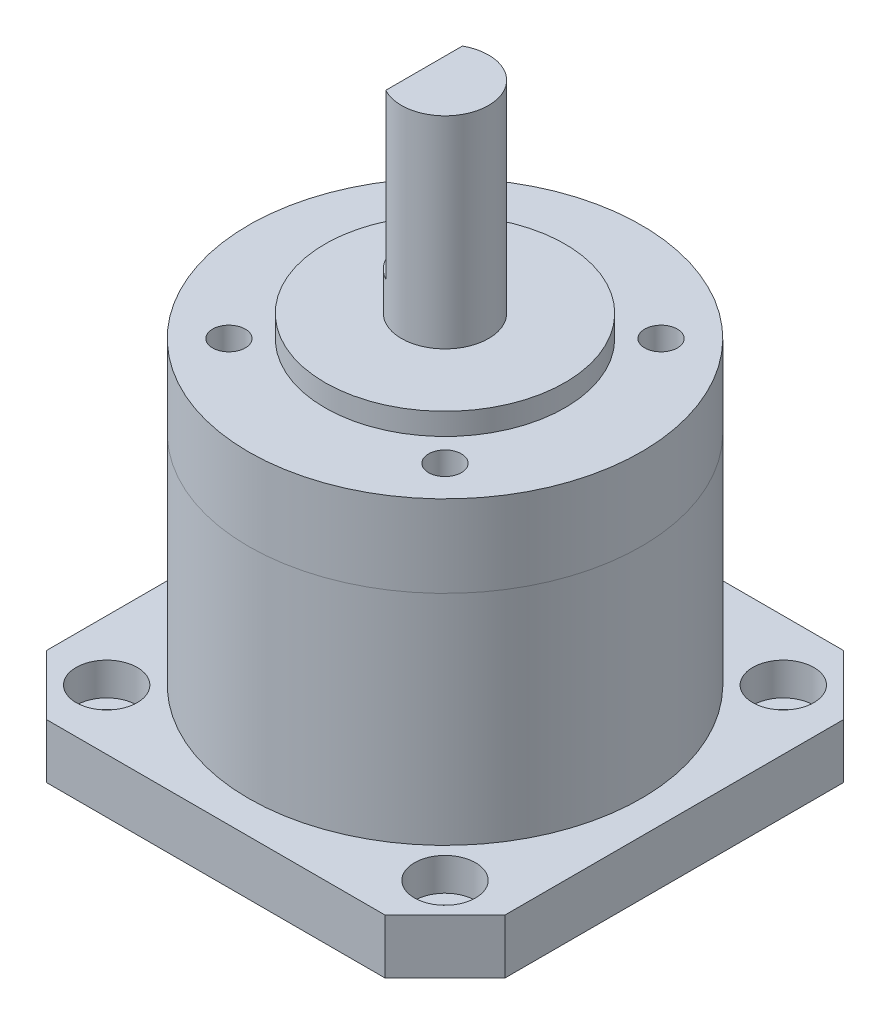
ISO-10303-21;
HEADER;
FILE_DESCRIPTION(('STEP AP214'),'2;1');
FILE_NAME('part.step','',(''),(''),'','','');
FILE_SCHEMA(('AUTOMOTIVE_DESIGN { 1 0 10303 214 1 1 1 1 }'));
ENDSEC;
DATA;
#1=APPLICATION_CONTEXT('core data for automotive mechanical design processes');
#2=APPLICATION_PROTOCOL_DEFINITION('international standard','automotive_design',2000,#1);
#3=PRODUCT_CONTEXT('',#1,'mechanical');
#4=PRODUCT('Part','Part','',(#3));
#5=PRODUCT_RELATED_PRODUCT_CATEGORY('part','',(#4));
#6=PRODUCT_DEFINITION_FORMATION('','',#4);
#7=PRODUCT_DEFINITION_CONTEXT('part definition',#1,'design');
#8=PRODUCT_DEFINITION('design','',#6,#7);
#9=PRODUCT_DEFINITION_SHAPE('','',#8);
#10=(LENGTH_UNIT() NAMED_UNIT(*) SI_UNIT(.MILLI.,.METRE.));
#11=(NAMED_UNIT(*) PLANE_ANGLE_UNIT() SI_UNIT($,.RADIAN.));
#12=(NAMED_UNIT(*) SI_UNIT($,.STERADIAN.) SOLID_ANGLE_UNIT());
#13=UNCERTAINTY_MEASURE_WITH_UNIT(LENGTH_MEASURE(1.E-05),#10,'distance_accuracy_value','');
#14=(GEOMETRIC_REPRESENTATION_CONTEXT(3) GLOBAL_UNCERTAINTY_ASSIGNED_CONTEXT((#13)) GLOBAL_UNIT_ASSIGNED_CONTEXT((#10,
#11,#12)) REPRESENTATION_CONTEXT('',''));
#15=CARTESIAN_POINT('',(0.,0.,0.));
#16=DIRECTION('',(0.,0.,1.));
#17=DIRECTION('',(1.,0.,0.));
#18=AXIS2_PLACEMENT_3D('',#15,#16,#17);
#19=CARTESIAN_POINT('',(-15.5000000000001,9.24264068712275,15.5));
#20=DIRECTION('',(0.,-1.,0.));
#21=DIRECTION('',(0.,0.,-1.));
#22=AXIS2_PLACEMENT_3D('',#19,#20,#21);
#23=CYLINDRICAL_SURFACE('',#22,1.5);
#24=CARTESIAN_POINT('',(-15.5000000000001,0.,15.5));
#25=DIRECTION('',(0.,-1.,0.));
#26=DIRECTION('',(0.,0.,-1.));
#27=AXIS2_PLACEMENT_3D('',#24,#25,#26);
#28=CIRCLE('',#27,1.5);
#29=CARTESIAN_POINT('',(-15.5000000000001,0.,14.));
#30=VERTEX_POINT('',#29);
#31=EDGE_CURVE('E226',#30,#30,#28,.T.);
#32=ORIENTED_EDGE('',*,*,#31,.T.);
#33=EDGE_LOOP('',(#32));
#34=FACE_BOUND('',#33,.T.);
#35=CARTESIAN_POINT('',(-15.5000000000001,2.,15.5));
#36=DIRECTION('',(0.,1.,0.));
#37=DIRECTION('',(0.,0.,1.));
#38=AXIS2_PLACEMENT_3D('',#35,#36,#37);
#39=CIRCLE('',#38,1.5);
#40=CARTESIAN_POINT('',(-15.5000000000001,2.,17.));
#41=VERTEX_POINT('',#40);
#42=EDGE_CURVE('E48',#41,#41,#39,.F.);
#43=ORIENTED_EDGE('',*,*,#42,.F.);
#44=EDGE_LOOP('',(#43));
#45=FACE_BOUND('',#44,.T.);
#46=ADVANCED_FACE('F43',(#34,#45),#23,.F.);
#47=CARTESIAN_POINT('',(15.5,9.24264068712275,15.5000000000009));
#48=DIRECTION('',(0.,-1.,0.));
#49=DIRECTION('',(0.,0.,-1.));
#50=AXIS2_PLACEMENT_3D('',#47,#48,#49);
#51=CYLINDRICAL_SURFACE('',#50,1.5000000000009);
#52=CARTESIAN_POINT('',(15.5,0.,15.5000000000009));
#53=DIRECTION('',(0.,-1.,0.));
#54=DIRECTION('',(0.,0.,-1.));
#55=AXIS2_PLACEMENT_3D('',#52,#53,#54);
#56=CIRCLE('',#55,1.5000000000009);
#57=CARTESIAN_POINT('',(15.5,0.,14.));
#58=VERTEX_POINT('',#57);
#59=EDGE_CURVE('E222',#58,#58,#56,.T.);
#60=ORIENTED_EDGE('',*,*,#59,.T.);
#61=EDGE_LOOP('',(#60));
#62=FACE_BOUND('',#61,.T.);
#63=CARTESIAN_POINT('',(15.5,2.,15.5000000000009));
#64=DIRECTION('',(0.,1.,0.));
#65=DIRECTION('',(0.,0.,1.));
#66=AXIS2_PLACEMENT_3D('',#63,#64,#65);
#67=CIRCLE('',#66,1.5000000000009);
#68=CARTESIAN_POINT('',(15.5,2.,17.0000000000018));
#69=VERTEX_POINT('',#68);
#70=EDGE_CURVE('E325',#69,#69,#67,.F.);
#71=ORIENTED_EDGE('',*,*,#70,.F.);
#72=EDGE_LOOP('',(#71));
#73=FACE_BOUND('',#72,.T.);
#74=ADVANCED_FACE('F337',(#62,#73),#51,.F.);
#75=CARTESIAN_POINT('',(15.5000000000009,9.24264068712275,-15.4999999999991));
#76=DIRECTION('',(0.,-1.,0.));
#77=DIRECTION('',(0.,0.,-1.));
#78=AXIS2_PLACEMENT_3D('',#75,#76,#77);
#79=CYLINDRICAL_SURFACE('',#78,1.50000000000123);
#80=CARTESIAN_POINT('',(15.5000000000009,0.,-15.4999999999991));
#81=DIRECTION('',(0.,-1.,0.));
#82=DIRECTION('',(0.,0.,-1.));
#83=AXIS2_PLACEMENT_3D('',#80,#81,#82);
#84=CIRCLE('',#83,1.50000000000123);
#85=CARTESIAN_POINT('',(15.5000000000009,0.,-17.0000000000004));
#86=VERTEX_POINT('',#85);
#87=EDGE_CURVE('E227',#86,#86,#84,.T.);
#88=ORIENTED_EDGE('',*,*,#87,.T.);
#89=EDGE_LOOP('',(#88));
#90=FACE_BOUND('',#89,.T.);
#91=CARTESIAN_POINT('',(15.5000000000009,2.,-15.4999999999991));
#92=DIRECTION('',(0.,1.,0.));
#93=DIRECTION('',(0.,0.,1.));
#94=AXIS2_PLACEMENT_3D('',#91,#92,#93);
#95=CIRCLE('',#94,1.50000000000123);
#96=CARTESIAN_POINT('',(15.5000000000009,2.,-13.9999999999979));
#97=VERTEX_POINT('',#96);
#98=EDGE_CURVE('E321',#97,#97,#95,.F.);
#99=ORIENTED_EDGE('',*,*,#98,.F.);
#100=EDGE_LOOP('',(#99));
#101=FACE_BOUND('',#100,.T.);
#102=ADVANCED_FACE('F344',(#90,#101),#79,.F.);
#103=CARTESIAN_POINT('',(-15.4999999999991,9.24264068712275,-15.5000000000001));
#104=DIRECTION('',(0.,-1.,0.));
#105=DIRECTION('',(0.,0.,-1.));
#106=AXIS2_PLACEMENT_3D('',#103,#104,#105);
#107=CYLINDRICAL_SURFACE('',#106,1.50000000000047);
#108=CARTESIAN_POINT('',(-15.4999999999991,0.,-15.5000000000001));
#109=DIRECTION('',(0.,-1.,0.));
#110=DIRECTION('',(0.,0.,-1.));
#111=AXIS2_PLACEMENT_3D('',#108,#109,#110);
#112=CIRCLE('',#111,1.50000000000047);
#113=CARTESIAN_POINT('',(-15.4999999999991,0.,-17.0000000000005));
#114=VERTEX_POINT('',#113);
#115=EDGE_CURVE('E218',#114,#114,#112,.T.);
#116=ORIENTED_EDGE('',*,*,#115,.T.);
#117=EDGE_LOOP('',(#116));
#118=FACE_BOUND('',#117,.T.);
#119=CARTESIAN_POINT('',(-15.4999999999991,2.,-15.5000000000001));
#120=DIRECTION('',(0.,1.,0.));
#121=DIRECTION('',(0.,0.,1.));
#122=AXIS2_PLACEMENT_3D('',#119,#120,#121);
#123=CIRCLE('',#122,1.50000000000047);
#124=CARTESIAN_POINT('',(-15.4999999999991,2.,-13.9999999999996));
#125=VERTEX_POINT('',#124);
#126=EDGE_CURVE('E317',#125,#125,#123,.F.);
#127=ORIENTED_EDGE('',*,*,#126,.F.);
#128=EDGE_LOOP('',(#127));
#129=FACE_BOUND('',#128,.T.);
#130=ADVANCED_FACE('F349',(#118,#129),#107,.F.);
#131=CARTESIAN_POINT('',(0.,53.,0.));
#132=DIRECTION('',(0.,-1.,0.));
#133=DIRECTION('',(0.,0.,-1.));
#134=AXIS2_PLACEMENT_3D('',#131,#132,#133);
#135=CYLINDRICAL_SURFACE('',#134,4.);
#136=CARTESIAN_POINT('',(0.,34.5,0.));
#137=DIRECTION('',(0.,1.,0.));
#138=DIRECTION('',(0.,0.,1.));
#139=AXIS2_PLACEMENT_3D('',#136,#137,#138);
#140=CIRCLE('',#139,4.);
#141=CARTESIAN_POINT('',(0.,34.5,4.));
#142=VERTEX_POINT('',#141);
#143=EDGE_CURVE('E54',#142,#142,#140,.T.);
#144=ORIENTED_EDGE('',*,*,#143,.T.);
#145=EDGE_LOOP('',(#144));
#146=FACE_BOUND('',#145,.T.);
#147=DIRECTION('',(0.,1.,0.));
#148=VECTOR('',#147,1.);
#149=CARTESIAN_POINT('',(-1.91418574428097,38.,-3.51224898553498));
#150=LINE('',#149,#148);
#151=CARTESIAN_POINT('',(-1.91418574428097,38.,-3.51224898553498));
#152=VERTEX_POINT('',#151);
#153=CARTESIAN_POINT('',(-1.91418574428097,53.,-3.51224898553498));
#154=VERTEX_POINT('',#153);
#155=EDGE_CURVE('E124',#152,#154,#150,.T.);
#156=ORIENTED_EDGE('',*,*,#155,.T.);
#157=CARTESIAN_POINT('',(0.,53.,0.));
#158=DIRECTION('',(0.,1.,0.));
#159=DIRECTION('',(0.,0.,1.));
#160=AXIS2_PLACEMENT_3D('',#157,#158,#159);
#161=CIRCLE('',#160,4.);
#162=CARTESIAN_POINT('',(-1.91418574428097,53.,3.51224898553498));
#163=VERTEX_POINT('',#162);
#164=EDGE_CURVE('E163',#163,#154,#161,.T.);
#165=ORIENTED_EDGE('',*,*,#164,.F.);
#166=DIRECTION('',(0.,1.,0.));
#167=VECTOR('',#166,1.);
#168=CARTESIAN_POINT('',(-1.91418574428097,38.,3.51224898553498));
#169=LINE('',#168,#167);
#170=CARTESIAN_POINT('',(-1.91418574428097,38.,3.51224898553498));
#171=VERTEX_POINT('',#170);
#172=EDGE_CURVE('E62',#171,#163,#169,.T.);
#173=ORIENTED_EDGE('',*,*,#172,.F.);
#174=CARTESIAN_POINT('',(0.,38.,0.));
#175=DIRECTION('',(0.,1.,0.));
#176=DIRECTION('',(0.,0.,1.));
#177=AXIS2_PLACEMENT_3D('',#174,#175,#176);
#178=CIRCLE('',#177,4.);
#179=EDGE_CURVE('E135',#152,#171,#178,.T.);
#180=ORIENTED_EDGE('',*,*,#179,.F.);
#181=EDGE_LOOP('',(#156,#165,#173,#180));
#182=FACE_BOUND('',#181,.T.);
#183=ADVANCED_FACE('F141',(#146,#182),#135,.T.);
#184=CARTESIAN_POINT('',(0.,53.,0.));
#185=DIRECTION('',(0.,1.,0.));
#186=DIRECTION('',(0.,0.,1.));
#187=AXIS2_PLACEMENT_3D('',#184,#185,#186);
#188=PLANE('',#187);
#189=ORIENTED_EDGE('',*,*,#164,.T.);
#190=DIRECTION('',(0.,0.,1.));
#191=VECTOR('',#190,1.);
#192=CARTESIAN_POINT('',(-1.91418574428097,53.,0.));
#193=LINE('',#192,#191);
#194=EDGE_CURVE('E129',#154,#163,#193,.T.);
#195=ORIENTED_EDGE('',*,*,#194,.T.);
#196=EDGE_LOOP('',(#189,#195));
#197=FACE_BOUND('',#196,.T.);
#198=ADVANCED_FACE('F436',(#197),#188,.T.);
#199=CARTESIAN_POINT('',(0.,32.5,0.));
#200=DIRECTION('',(0.,-1.,0.));
#201=DIRECTION('',(0.,0.,-1.));
#202=AXIS2_PLACEMENT_3D('',#199,#200,#201);
#203=CYLINDRICAL_SURFACE('',#202,18.);
#204=CARTESIAN_POINT('',(0.,32.5,0.));
#205=DIRECTION('',(0.,1.,0.));
#206=DIRECTION('',(0.,0.,1.));
#207=AXIS2_PLACEMENT_3D('',#204,#205,#206);
#208=CIRCLE('',#207,18.);
#209=CARTESIAN_POINT('',(0.,32.5,18.));
#210=VERTEX_POINT('',#209);
#211=EDGE_CURVE('E214',#210,#210,#208,.T.);
#212=ORIENTED_EDGE('',*,*,#211,.F.);
#213=EDGE_LOOP('',(#212));
#214=FACE_BOUND('',#213,.T.);
#215=CARTESIAN_POINT('',(0.,25.,0.));
#216=DIRECTION('',(0.,1.,0.));
#217=DIRECTION('',(0.,0.,1.));
#218=AXIS2_PLACEMENT_3D('',#215,#216,#217);
#219=CIRCLE('',#218,18.);
#220=CARTESIAN_POINT('',(0.,25.,18.));
#221=VERTEX_POINT('',#220);
#222=EDGE_CURVE('E12',#221,#221,#219,.T.);
#223=ORIENTED_EDGE('',*,*,#222,.T.);
#224=EDGE_LOOP('',(#223));
#225=FACE_BOUND('',#224,.T.);
#226=ADVANCED_FACE('F374',(#214,#225),#203,.T.);
#227=CARTESIAN_POINT('',(21.,5.,-21.));
#228=DIRECTION('',(-1.,0.,0.));
#229=DIRECTION('',(0.,0.,1.));
#230=AXIS2_PLACEMENT_3D('',#227,#228,#229);
#231=PLANE('',#230);
#232=DIRECTION('',(0.,0.,-1.));
#233=VECTOR('',#232,1.);
#234=CARTESIAN_POINT('',(21.,5.,-21.));
#235=LINE('',#234,#233);
#236=CARTESIAN_POINT('',(21.,5.,15.5));
#237=VERTEX_POINT('',#236);
#238=CARTESIAN_POINT('',(21.,5.,-15.5));
#239=VERTEX_POINT('',#238);
#240=EDGE_CURVE('E238',#237,#239,#235,.T.);
#241=ORIENTED_EDGE('',*,*,#240,.F.);
#242=DIRECTION('',(0.,-1.,0.));
#243=VECTOR('',#242,1.);
#244=CARTESIAN_POINT('',(21.,5.,15.5));
#245=LINE('',#244,#243);
#246=CARTESIAN_POINT('',(21.,0.,15.5));
#247=VERTEX_POINT('',#246);
#248=EDGE_CURVE('E308',#237,#247,#245,.T.);
#249=ORIENTED_EDGE('',*,*,#248,.T.);
#250=DIRECTION('',(0.,0.,-1.));
#251=VECTOR('',#250,1.);
#252=CARTESIAN_POINT('',(21.,0.,-21.));
#253=LINE('',#252,#251);
#254=CARTESIAN_POINT('',(21.,0.,-15.5));
#255=VERTEX_POINT('',#254);
#256=EDGE_CURVE('E237',#247,#255,#253,.T.);
#257=ORIENTED_EDGE('',*,*,#256,.T.);
#258=DIRECTION('',(0.,1.,0.));
#259=VECTOR('',#258,1.);
#260=CARTESIAN_POINT('',(21.,5.,-15.5));
#261=LINE('',#260,#259);
#262=EDGE_CURVE('E305',#255,#239,#261,.T.);
#263=ORIENTED_EDGE('',*,*,#262,.T.);
#264=EDGE_LOOP('',(#241,#249,#257,#263));
#265=FACE_BOUND('',#264,.T.);
#266=ADVANCED_FACE('F371',(#265),#231,.F.);
#267=CARTESIAN_POINT('',(-21.,5.,-21.));
#268=DIRECTION('',(0.,0.,1.));
#269=DIRECTION('',(1.,0.,0.));
#270=AXIS2_PLACEMENT_3D('',#267,#268,#269);
#271=PLANE('',#270);
#272=DIRECTION('',(-1.,0.,0.));
#273=VECTOR('',#272,1.);
#274=CARTESIAN_POINT('',(-21.,5.,-21.));
#275=LINE('',#274,#273);
#276=CARTESIAN_POINT('',(15.5,5.,-21.));
#277=VERTEX_POINT('',#276);
#278=CARTESIAN_POINT('',(-15.5,5.,-21.));
#279=VERTEX_POINT('',#278);
#280=EDGE_CURVE('E242',#277,#279,#275,.T.);
#281=ORIENTED_EDGE('',*,*,#280,.F.);
#282=DIRECTION('',(0.,-1.,0.));
#283=VECTOR('',#282,1.);
#284=CARTESIAN_POINT('',(15.5,5.,-21.));
#285=LINE('',#284,#283);
#286=CARTESIAN_POINT('',(15.5,0.,-21.));
#287=VERTEX_POINT('',#286);
#288=EDGE_CURVE('E173',#277,#287,#285,.T.);
#289=ORIENTED_EDGE('',*,*,#288,.T.);
#290=DIRECTION('',(-1.,0.,0.));
#291=VECTOR('',#290,1.);
#292=CARTESIAN_POINT('',(-21.,0.,-21.));
#293=LINE('',#292,#291);
#294=CARTESIAN_POINT('',(-15.5,0.,-21.));
#295=VERTEX_POINT('',#294);
#296=EDGE_CURVE('E258',#287,#295,#293,.T.);
#297=ORIENTED_EDGE('',*,*,#296,.T.);
#298=DIRECTION('',(0.,1.,0.));
#299=VECTOR('',#298,1.);
#300=CARTESIAN_POINT('',(-15.5,5.,-21.));
#301=LINE('',#300,#299);
#302=EDGE_CURVE('E70',#295,#279,#301,.T.);
#303=ORIENTED_EDGE('',*,*,#302,.T.);
#304=EDGE_LOOP('',(#281,#289,#297,#303));
#305=FACE_BOUND('',#304,.T.);
#306=ADVANCED_FACE('F367',(#305),#271,.F.);
#307=CARTESIAN_POINT('',(-21.,5.,-21.));
#308=DIRECTION('',(1.,0.,0.));
#309=DIRECTION('',(0.,0.,-1.));
#310=AXIS2_PLACEMENT_3D('',#307,#308,#309);
#311=PLANE('',#310);
#312=DIRECTION('',(0.,0.,1.));
#313=VECTOR('',#312,1.);
#314=CARTESIAN_POINT('',(-21.,0.,-21.));
#315=LINE('',#314,#313);
#316=CARTESIAN_POINT('',(-21.,0.,-15.5));
#317=VERTEX_POINT('',#316);
#318=CARTESIAN_POINT('',(-21.,0.,15.5));
#319=VERTEX_POINT('',#318);
#320=EDGE_CURVE('E261',#317,#319,#315,.T.);
#321=ORIENTED_EDGE('',*,*,#320,.T.);
#322=DIRECTION('',(0.,1.,0.));
#323=VECTOR('',#322,1.);
#324=CARTESIAN_POINT('',(-21.,5.,15.5));
#325=LINE('',#324,#323);
#326=CARTESIAN_POINT('',(-21.,5.,15.5));
#327=VERTEX_POINT('',#326);
#328=EDGE_CURVE('E290',#319,#327,#325,.T.);
#329=ORIENTED_EDGE('',*,*,#328,.T.);
#330=DIRECTION('',(0.,0.,1.));
#331=VECTOR('',#330,1.);
#332=CARTESIAN_POINT('',(-21.,5.,-21.));
#333=LINE('',#332,#331);
#334=CARTESIAN_POINT('',(-21.,5.,-15.5));
#335=VERTEX_POINT('',#334);
#336=EDGE_CURVE('E246',#335,#327,#333,.T.);
#337=ORIENTED_EDGE('',*,*,#336,.F.);
#338=DIRECTION('',(0.,-1.,0.));
#339=VECTOR('',#338,1.);
#340=CARTESIAN_POINT('',(-21.,5.,-15.5));
#341=LINE('',#340,#339);
#342=EDGE_CURVE('E286',#335,#317,#341,.T.);
#343=ORIENTED_EDGE('',*,*,#342,.T.);
#344=EDGE_LOOP('',(#321,#329,#337,#343));
#345=FACE_BOUND('',#344,.T.);
#346=ADVANCED_FACE('F363',(#345),#311,.F.);
#347=CARTESIAN_POINT('',(-21.,5.,21.));
#348=DIRECTION('',(0.,0.,-1.));
#349=DIRECTION('',(-1.,0.,0.));
#350=AXIS2_PLACEMENT_3D('',#347,#348,#349);
#351=PLANE('',#350);
#352=DIRECTION('',(1.,0.,0.));
#353=VECTOR('',#352,1.);
#354=CARTESIAN_POINT('',(-21.,5.,21.));
#355=LINE('',#354,#353);
#356=CARTESIAN_POINT('',(-15.5,5.,21.));
#357=VERTEX_POINT('',#356);
#358=CARTESIAN_POINT('',(15.5,5.,21.));
#359=VERTEX_POINT('',#358);
#360=EDGE_CURVE('E250',#357,#359,#355,.T.);
#361=ORIENTED_EDGE('',*,*,#360,.F.);
#362=DIRECTION('',(0.,-1.,0.));
#363=VECTOR('',#362,1.);
#364=CARTESIAN_POINT('',(-15.5,5.,21.));
#365=LINE('',#364,#363);
#366=CARTESIAN_POINT('',(-15.5,0.,21.));
#367=VERTEX_POINT('',#366);
#368=EDGE_CURVE('E270',#357,#367,#365,.T.);
#369=ORIENTED_EDGE('',*,*,#368,.T.);
#370=DIRECTION('',(1.,0.,0.));
#371=VECTOR('',#370,1.);
#372=CARTESIAN_POINT('',(-21.,0.,21.));
#373=LINE('',#372,#371);
#374=CARTESIAN_POINT('',(15.5,0.,21.));
#375=VERTEX_POINT('',#374);
#376=EDGE_CURVE('E243',#367,#375,#373,.T.);
#377=ORIENTED_EDGE('',*,*,#376,.T.);
#378=DIRECTION('',(0.,1.,0.));
#379=VECTOR('',#378,1.);
#380=CARTESIAN_POINT('',(15.5,5.,21.));
#381=LINE('',#380,#379);
#382=EDGE_CURVE('E254',#375,#359,#381,.T.);
#383=ORIENTED_EDGE('',*,*,#382,.T.);
#384=EDGE_LOOP('',(#361,#369,#377,#383));
#385=FACE_BOUND('',#384,.T.);
#386=ADVANCED_FACE('F355',(#385),#351,.F.);
#387=CARTESIAN_POINT('',(0.,5.,0.));
#388=DIRECTION('',(0.,1.,0.));
#389=DIRECTION('',(0.,0.,1.));
#390=AXIS2_PLACEMENT_3D('',#387,#388,#389);
#391=PLANE('',#390);
#392=CARTESIAN_POINT('',(15.5000000000009,5.,-15.4999999999991));
#393=DIRECTION('',(0.,1.,0.));
#394=DIRECTION('',(0.,0.,1.));
#395=AXIS2_PLACEMENT_3D('',#392,#393,#394);
#396=CIRCLE('',#395,2.8);
#397=CARTESIAN_POINT('',(15.5000000000009,5.,-12.6999999999991));
#398=VERTEX_POINT('',#397);
#399=EDGE_CURVE('E709',#398,#398,#396,.T.);
#400=ORIENTED_EDGE('',*,*,#399,.F.);
#401=EDGE_LOOP('',(#400));
#402=FACE_BOUND('',#401,.T.);
#403=CARTESIAN_POINT('',(-15.5000000000001,5.,15.5));
#404=DIRECTION('',(0.,1.,0.));
#405=DIRECTION('',(0.,0.,1.));
#406=AXIS2_PLACEMENT_3D('',#403,#404,#405);
#407=CIRCLE('',#406,2.8);
#408=CARTESIAN_POINT('',(-15.5000000000001,5.,18.3));
#409=VERTEX_POINT('',#408);
#410=EDGE_CURVE('E702',#409,#409,#407,.T.);
#411=ORIENTED_EDGE('',*,*,#410,.F.);
#412=EDGE_LOOP('',(#411));
#413=FACE_BOUND('',#412,.T.);
#414=CARTESIAN_POINT('',(15.5,5.,15.5000000000009));
#415=DIRECTION('',(0.,1.,0.));
#416=DIRECTION('',(0.,0.,1.));
#417=AXIS2_PLACEMENT_3D('',#414,#415,#416);
#418=CIRCLE('',#417,2.8);
#419=CARTESIAN_POINT('',(15.5,5.,18.3000000000009));
#420=VERTEX_POINT('',#419);
#421=EDGE_CURVE('E712',#420,#420,#418,.T.);
#422=ORIENTED_EDGE('',*,*,#421,.F.);
#423=EDGE_LOOP('',(#422));
#424=FACE_BOUND('',#423,.T.);
#425=CARTESIAN_POINT('',(-15.4999999999991,5.,-15.5000000000001));
#426=DIRECTION('',(0.,1.,0.));
#427=DIRECTION('',(0.,0.,1.));
#428=AXIS2_PLACEMENT_3D('',#425,#426,#427);
#429=CIRCLE('',#428,2.8);
#430=CARTESIAN_POINT('',(-15.4999999999991,5.,-12.7000000000001));
#431=VERTEX_POINT('',#430);
#432=EDGE_CURVE('E718',#431,#431,#429,.T.);
#433=ORIENTED_EDGE('',*,*,#432,.F.);
#434=EDGE_LOOP('',(#433));
#435=FACE_BOUND('',#434,.T.);
#436=CARTESIAN_POINT('',(0.,5.,0.));
#437=DIRECTION('',(0.,1.,0.));
#438=DIRECTION('',(0.,0.,1.));
#439=AXIS2_PLACEMENT_3D('',#436,#437,#438);
#440=CIRCLE('',#439,18.);
#441=CARTESIAN_POINT('',(0.,5.,18.));
#442=VERTEX_POINT('',#441);
#443=EDGE_CURVE('E210',#442,#442,#440,.T.);
#444=ORIENTED_EDGE('',*,*,#443,.F.);
#445=EDGE_LOOP('',(#444));
#446=FACE_BOUND('',#445,.T.);
#447=ORIENTED_EDGE('',*,*,#336,.T.);
#448=DIRECTION('',(-0.707106781186547,0.,-0.707106781186548));
#449=VECTOR('',#448,1.);
#450=CARTESIAN_POINT('',(-18.25,5.,18.25));
#451=LINE('',#450,#449);
#452=EDGE_CURVE('E302',#327,#357,#451,.F.);
#453=ORIENTED_EDGE('',*,*,#452,.T.);
#454=ORIENTED_EDGE('',*,*,#360,.T.);
#455=DIRECTION('',(-0.707106781186548,0.,0.707106781186547));
#456=VECTOR('',#455,1.);
#457=CARTESIAN_POINT('',(18.25,5.,18.25));
#458=LINE('',#457,#456);
#459=EDGE_CURVE('E299',#359,#237,#458,.F.);
#460=ORIENTED_EDGE('',*,*,#459,.T.);
#461=ORIENTED_EDGE('',*,*,#240,.T.);
#462=DIRECTION('',(0.707106781186548,0.,0.707106781186547));
#463=VECTOR('',#462,1.);
#464=CARTESIAN_POINT('',(18.25,5.,-18.25));
#465=LINE('',#464,#463);
#466=EDGE_CURVE('E296',#239,#277,#465,.F.);
#467=ORIENTED_EDGE('',*,*,#466,.T.);
#468=ORIENTED_EDGE('',*,*,#280,.T.);
#469=DIRECTION('',(0.707106781186548,0.,-0.707106781186548));
#470=VECTOR('',#469,1.);
#471=CARTESIAN_POINT('',(-18.25,5.,-18.25));
#472=LINE('',#471,#470);
#473=EDGE_CURVE('E293',#279,#335,#472,.F.);
#474=ORIENTED_EDGE('',*,*,#473,.T.);
#475=EDGE_LOOP('',(#447,#453,#454,#460,#461,#467,#468,#474));
#476=FACE_BOUND('',#475,.T.);
#477=ADVANCED_FACE('F351',(#402,#413,#424,#435,#446,#476),#391,.T.);
#478=CARTESIAN_POINT('',(0.,0.,0.));
#479=DIRECTION('',(0.,1.,0.));
#480=DIRECTION('',(0.,0.,1.));
#481=AXIS2_PLACEMENT_3D('',#478,#479,#480);
#482=PLANE('',#481);
#483=CARTESIAN_POINT('',(0.,0.,0.));
#484=DIRECTION('',(0.,-1.,0.));
#485=DIRECTION('',(0.,0.,-1.));
#486=AXIS2_PLACEMENT_3D('',#483,#484,#485);
#487=CIRCLE('',#486,11.);
#488=CARTESIAN_POINT('',(0.,0.,-11.));
#489=VERTEX_POINT('',#488);
#490=EDGE_CURVE('E155',#489,#489,#487,.T.);
#491=ORIENTED_EDGE('',*,*,#490,.F.);
#492=EDGE_LOOP('',(#491));
#493=FACE_BOUND('',#492,.T.);
#494=ORIENTED_EDGE('',*,*,#115,.F.);
#495=EDGE_LOOP('',(#494));
#496=FACE_BOUND('',#495,.T.);
#497=ORIENTED_EDGE('',*,*,#87,.F.);
#498=EDGE_LOOP('',(#497));
#499=FACE_BOUND('',#498,.T.);
#500=ORIENTED_EDGE('',*,*,#59,.F.);
#501=EDGE_LOOP('',(#500));
#502=FACE_BOUND('',#501,.T.);
#503=ORIENTED_EDGE('',*,*,#31,.F.);
#504=EDGE_LOOP('',(#503));
#505=FACE_BOUND('',#504,.T.);
#506=ORIENTED_EDGE('',*,*,#376,.F.);
#507=DIRECTION('',(0.707106781186547,0.,0.707106781186548));
#508=VECTOR('',#507,1.);
#509=CARTESIAN_POINT('',(-15.5,0.,21.));
#510=LINE('',#509,#508);
#511=EDGE_CURVE('E283',#367,#319,#510,.F.);
#512=ORIENTED_EDGE('',*,*,#511,.T.);
#513=ORIENTED_EDGE('',*,*,#320,.F.);
#514=DIRECTION('',(-0.707106781186548,0.,0.707106781186548));
#515=VECTOR('',#514,1.);
#516=CARTESIAN_POINT('',(-21.,0.,-15.5));
#517=LINE('',#516,#515);
#518=EDGE_CURVE('E274',#317,#295,#517,.F.);
#519=ORIENTED_EDGE('',*,*,#518,.T.);
#520=ORIENTED_EDGE('',*,*,#296,.F.);
#521=DIRECTION('',(-0.707106781186548,0.,-0.707106781186547));
#522=VECTOR('',#521,1.);
#523=CARTESIAN_POINT('',(15.5,0.,-21.));
#524=LINE('',#523,#522);
#525=EDGE_CURVE('E277',#287,#255,#524,.F.);
#526=ORIENTED_EDGE('',*,*,#525,.T.);
#527=ORIENTED_EDGE('',*,*,#256,.F.);
#528=DIRECTION('',(0.707106781186548,0.,-0.707106781186547));
#529=VECTOR('',#528,1.);
#530=CARTESIAN_POINT('',(21.,0.,15.5));
#531=LINE('',#530,#529);
#532=EDGE_CURVE('E280',#247,#375,#531,.F.);
#533=ORIENTED_EDGE('',*,*,#532,.T.);
#534=EDGE_LOOP('',(#506,#512,#513,#519,#520,#526,#527,#533));
#535=FACE_BOUND('',#534,.T.);
#536=ADVANCED_FACE('F354',(#493,#496,#499,#502,#505,#535),#482,.F.);
#537=CARTESIAN_POINT('',(-15.5,5.,21.));
#538=DIRECTION('',(0.707106781186548,0.,-0.707106781186547));
#539=DIRECTION('',(0.,-1.,0.));
#540=AXIS2_PLACEMENT_3D('',#537,#538,#539);
#541=PLANE('',#540);
#542=ORIENTED_EDGE('',*,*,#452,.F.);
#543=ORIENTED_EDGE('',*,*,#328,.F.);
#544=ORIENTED_EDGE('',*,*,#511,.F.);
#545=ORIENTED_EDGE('',*,*,#368,.F.);
#546=EDGE_LOOP('',(#542,#543,#544,#545));
#547=FACE_BOUND('',#546,.T.);
#548=ADVANCED_FACE('F359',(#547),#541,.F.);
#549=CARTESIAN_POINT('',(21.,5.,15.5));
#550=DIRECTION('',(-0.707106781186547,0.,-0.707106781186548));
#551=DIRECTION('',(0.,-1.,0.));
#552=AXIS2_PLACEMENT_3D('',#549,#550,#551);
#553=PLANE('',#552);
#554=ORIENTED_EDGE('',*,*,#459,.F.);
#555=ORIENTED_EDGE('',*,*,#382,.F.);
#556=ORIENTED_EDGE('',*,*,#532,.F.);
#557=ORIENTED_EDGE('',*,*,#248,.F.);
#558=EDGE_LOOP('',(#554,#555,#556,#557));
#559=FACE_BOUND('',#558,.T.);
#560=ADVANCED_FACE('F382',(#559),#553,.F.);
#561=CARTESIAN_POINT('',(15.5,5.,-21.));
#562=DIRECTION('',(-0.707106781186547,0.,0.707106781186548));
#563=DIRECTION('',(0.,-1.,0.));
#564=AXIS2_PLACEMENT_3D('',#561,#562,#563);
#565=PLANE('',#564);
#566=ORIENTED_EDGE('',*,*,#466,.F.);
#567=ORIENTED_EDGE('',*,*,#262,.F.);
#568=ORIENTED_EDGE('',*,*,#525,.F.);
#569=ORIENTED_EDGE('',*,*,#288,.F.);
#570=EDGE_LOOP('',(#566,#567,#568,#569));
#571=FACE_BOUND('',#570,.T.);
#572=ADVANCED_FACE('F388',(#571),#565,.F.);
#573=CARTESIAN_POINT('',(-21.,5.,-15.5));
#574=DIRECTION('',(0.707106781186547,0.,0.707106781186547));
#575=DIRECTION('',(0.,-1.,0.));
#576=AXIS2_PLACEMENT_3D('',#573,#574,#575);
#577=PLANE('',#576);
#578=ORIENTED_EDGE('',*,*,#473,.F.);
#579=ORIENTED_EDGE('',*,*,#302,.F.);
#580=ORIENTED_EDGE('',*,*,#518,.F.);
#581=ORIENTED_EDGE('',*,*,#342,.F.);
#582=EDGE_LOOP('',(#578,#579,#580,#581));
#583=FACE_BOUND('',#582,.T.);
#584=ADVANCED_FACE('F46',(#583),#577,.F.);
#585=ORIENTED_EDGE('',*,*,#222,.F.);
#586=EDGE_LOOP('',(#585));
#587=FACE_BOUND('',#586,.T.);
#588=ORIENTED_EDGE('',*,*,#443,.T.);
#589=EDGE_LOOP('',(#588));
#590=FACE_BOUND('',#589,.T.);
#591=ADVANCED_FACE('F397',(#587,#590),#203,.T.);
#592=CARTESIAN_POINT('',(0.,32.5,0.));
#593=DIRECTION('',(0.,1.,0.));
#594=DIRECTION('',(0.,0.,1.));
#595=AXIS2_PLACEMENT_3D('',#592,#593,#594);
#596=PLANE('',#595);
#597=CARTESIAN_POINT('',(0.,32.5,0.));
#598=DIRECTION('',(0.,1.,0.));
#599=DIRECTION('',(0.,0.,1.));
#600=AXIS2_PLACEMENT_3D('',#597,#598,#599);
#601=CIRCLE('',#600,11.);
#602=CARTESIAN_POINT('',(0.,32.5,11.));
#603=VERTEX_POINT('',#602);
#604=EDGE_CURVE('E169',#603,#603,#601,.T.);
#605=ORIENTED_EDGE('',*,*,#604,.F.);
#606=EDGE_LOOP('',(#605));
#607=FACE_BOUND('',#606,.T.);
#608=CARTESIAN_POINT('',(-9.89949493661111,32.5,9.89949493661168));
#609=DIRECTION('',(0.,1.,0.));
#610=DIRECTION('',(0.,0.,1.));
#611=AXIS2_PLACEMENT_3D('',#608,#609,#610);
#612=CIRCLE('',#611,1.50000000000029);
#613=CARTESIAN_POINT('',(-9.89949493661111,32.5,11.399494936612));
#614=VERTEX_POINT('',#613);
#615=EDGE_CURVE('E199',#614,#614,#612,.T.);
#616=ORIENTED_EDGE('',*,*,#615,.F.);
#617=EDGE_LOOP('',(#616));
#618=FACE_BOUND('',#617,.T.);
#619=CARTESIAN_POINT('',(9.89949493661223,32.5,9.89949493661111));
#620=DIRECTION('',(0.,1.,0.));
#621=DIRECTION('',(0.,0.,1.));
#622=AXIS2_PLACEMENT_3D('',#619,#620,#621);
#623=CIRCLE('',#622,1.50000000000078);
#624=CARTESIAN_POINT('',(9.89949493661223,32.5,11.3994949366119));
#625=VERTEX_POINT('',#624);
#626=EDGE_CURVE('E191',#625,#625,#623,.T.);
#627=ORIENTED_EDGE('',*,*,#626,.F.);
#628=EDGE_LOOP('',(#627));
#629=FACE_BOUND('',#628,.T.);
#630=CARTESIAN_POINT('',(9.89949493661167,32.5,-9.89949493661222));
#631=DIRECTION('',(0.,1.,0.));
#632=DIRECTION('',(0.,0.,1.));
#633=AXIS2_PLACEMENT_3D('',#630,#631,#632);
#634=CIRCLE('',#633,1.50000000000057);
#635=CARTESIAN_POINT('',(9.89949493661167,32.5,-8.39949493661165));
#636=VERTEX_POINT('',#635);
#637=EDGE_CURVE('E182',#636,#636,#634,.T.);
#638=ORIENTED_EDGE('',*,*,#637,.F.);
#639=EDGE_LOOP('',(#638));
#640=FACE_BOUND('',#639,.T.);
#641=CARTESIAN_POINT('',(-9.89949493661167,32.5,-9.89949493661166));
#642=DIRECTION('',(0.,1.,0.));
#643=DIRECTION('',(0.,0.,1.));
#644=AXIS2_PLACEMENT_3D('',#641,#642,#643);
#645=CIRCLE('',#644,1.5);
#646=CARTESIAN_POINT('',(-9.89949493661167,32.5,-8.39949493661166));
#647=VERTEX_POINT('',#646);
#648=EDGE_CURVE('E186',#647,#647,#645,.T.);
#649=ORIENTED_EDGE('',*,*,#648,.F.);
#650=EDGE_LOOP('',(#649));
#651=FACE_BOUND('',#650,.T.);
#652=ORIENTED_EDGE('',*,*,#211,.T.);
#653=EDGE_LOOP('',(#652));
#654=FACE_BOUND('',#653,.T.);
#655=ADVANCED_FACE('F423',(#607,#618,#629,#640,#651,#654),#596,.T.);
#656=CARTESIAN_POINT('',(-9.89949493661167,28.5,-9.89949493661166));
#657=DIRECTION('',(0.,1.,0.));
#658=DIRECTION('',(0.,0.,1.));
#659=AXIS2_PLACEMENT_3D('',#656,#657,#658);
#660=CYLINDRICAL_SURFACE('',#659,1.5);
#661=CARTESIAN_POINT('',(-9.89949493661167,28.5,-9.89949493661166));
#662=DIRECTION('',(0.,1.,0.));
#663=DIRECTION('',(0.,0.,1.));
#664=AXIS2_PLACEMENT_3D('',#661,#662,#663);
#665=CIRCLE('',#664,1.5);
#666=CARTESIAN_POINT('',(-9.89949493661167,28.5,-8.39949493661166));
#667=VERTEX_POINT('',#666);
#668=EDGE_CURVE('E206',#667,#667,#665,.T.);
#669=ORIENTED_EDGE('',*,*,#668,.F.);
#670=EDGE_LOOP('',(#669));
#671=FACE_BOUND('',#670,.T.);
#672=ORIENTED_EDGE('',*,*,#648,.T.);
#673=EDGE_LOOP('',(#672));
#674=FACE_BOUND('',#673,.T.);
#675=ADVANCED_FACE('F430',(#671,#674),#660,.F.);
#676=CARTESIAN_POINT('',(-9.89949493661167,28.5,-9.89949493661166));
#677=DIRECTION('',(0.,1.,0.));
#678=DIRECTION('',(0.,0.,1.));
#679=AXIS2_PLACEMENT_3D('',#676,#677,#678);
#680=PLANE('',#679);
#681=ORIENTED_EDGE('',*,*,#668,.T.);
#682=EDGE_LOOP('',(#681));
#683=FACE_BOUND('',#682,.T.);
#684=ADVANCED_FACE('F470',(#683),#680,.T.);
#685=CARTESIAN_POINT('',(9.89949493661167,28.5,-9.89949493661222));
#686=DIRECTION('',(0.,1.,0.));
#687=DIRECTION('',(0.,0.,1.));
#688=AXIS2_PLACEMENT_3D('',#685,#686,#687);
#689=CYLINDRICAL_SURFACE('',#688,1.50000000000057);
#690=CARTESIAN_POINT('',(9.89949493661167,28.5,-9.89949493661222));
#691=DIRECTION('',(0.,1.,0.));
#692=DIRECTION('',(0.,0.,1.));
#693=AXIS2_PLACEMENT_3D('',#690,#691,#692);
#694=CIRCLE('',#693,1.50000000000057);
#695=CARTESIAN_POINT('',(9.89949493661167,28.5,-8.39949493661165));
#696=VERTEX_POINT('',#695);
#697=EDGE_CURVE('E187',#696,#696,#694,.T.);
#698=ORIENTED_EDGE('',*,*,#697,.F.);
#699=EDGE_LOOP('',(#698));
#700=FACE_BOUND('',#699,.T.);
#701=ORIENTED_EDGE('',*,*,#637,.T.);
#702=EDGE_LOOP('',(#701));
#703=FACE_BOUND('',#702,.T.);
#704=ADVANCED_FACE('F466',(#700,#703),#689,.F.);
#705=CARTESIAN_POINT('',(9.89949493661167,28.5,-9.89949493661222));
#706=DIRECTION('',(0.,1.,0.));
#707=DIRECTION('',(0.,0.,1.));
#708=AXIS2_PLACEMENT_3D('',#705,#706,#707);
#709=PLANE('',#708);
#710=ORIENTED_EDGE('',*,*,#697,.T.);
#711=EDGE_LOOP('',(#710));
#712=FACE_BOUND('',#711,.T.);
#713=ADVANCED_FACE('F469',(#712),#709,.T.);
#714=CARTESIAN_POINT('',(9.89949493661223,28.5,9.89949493661111));
#715=DIRECTION('',(0.,1.,0.));
#716=DIRECTION('',(0.,0.,1.));
#717=AXIS2_PLACEMENT_3D('',#714,#715,#716);
#718=CYLINDRICAL_SURFACE('',#717,1.50000000000078);
#719=CARTESIAN_POINT('',(9.89949493661223,28.5,9.89949493661111));
#720=DIRECTION('',(0.,1.,0.));
#721=DIRECTION('',(0.,0.,1.));
#722=AXIS2_PLACEMENT_3D('',#719,#720,#721);
#723=CIRCLE('',#722,1.50000000000078);
#724=CARTESIAN_POINT('',(9.89949493661223,28.5,11.3994949366119));
#725=VERTEX_POINT('',#724);
#726=EDGE_CURVE('E195',#725,#725,#723,.T.);
#727=ORIENTED_EDGE('',*,*,#726,.F.);
#728=EDGE_LOOP('',(#727));
#729=FACE_BOUND('',#728,.T.);
#730=ORIENTED_EDGE('',*,*,#626,.T.);
#731=EDGE_LOOP('',(#730));
#732=FACE_BOUND('',#731,.T.);
#733=ADVANCED_FACE('F474',(#729,#732),#718,.F.);
#734=CARTESIAN_POINT('',(9.89949493661223,28.5,9.89949493661111));
#735=DIRECTION('',(0.,1.,0.));
#736=DIRECTION('',(0.,0.,1.));
#737=AXIS2_PLACEMENT_3D('',#734,#735,#736);
#738=PLANE('',#737);
#739=ORIENTED_EDGE('',*,*,#726,.T.);
#740=EDGE_LOOP('',(#739));
#741=FACE_BOUND('',#740,.T.);
#742=ADVANCED_FACE('F478',(#741),#738,.T.);
#743=CARTESIAN_POINT('',(-9.89949493661111,28.5,9.89949493661168));
#744=DIRECTION('',(0.,1.,0.));
#745=DIRECTION('',(0.,0.,1.));
#746=AXIS2_PLACEMENT_3D('',#743,#744,#745);
#747=CYLINDRICAL_SURFACE('',#746,1.50000000000029);
#748=CARTESIAN_POINT('',(-9.89949493661111,28.5,9.89949493661168));
#749=DIRECTION('',(0.,1.,0.));
#750=DIRECTION('',(0.,0.,1.));
#751=AXIS2_PLACEMENT_3D('',#748,#749,#750);
#752=CIRCLE('',#751,1.50000000000029);
#753=CARTESIAN_POINT('',(-9.89949493661111,28.5,11.399494936612));
#754=VERTEX_POINT('',#753);
#755=EDGE_CURVE('E178',#754,#754,#752,.T.);
#756=ORIENTED_EDGE('',*,*,#755,.F.);
#757=EDGE_LOOP('',(#756));
#758=FACE_BOUND('',#757,.T.);
#759=ORIENTED_EDGE('',*,*,#615,.T.);
#760=EDGE_LOOP('',(#759));
#761=FACE_BOUND('',#760,.T.);
#762=ADVANCED_FACE('F482',(#758,#761),#747,.F.);
#763=CARTESIAN_POINT('',(-9.89949493661111,28.5,9.89949493661168));
#764=DIRECTION('',(0.,1.,0.));
#765=DIRECTION('',(0.,0.,1.));
#766=AXIS2_PLACEMENT_3D('',#763,#764,#765);
#767=PLANE('',#766);
#768=ORIENTED_EDGE('',*,*,#755,.T.);
#769=EDGE_LOOP('',(#768));
#770=FACE_BOUND('',#769,.T.);
#771=ADVANCED_FACE('F464',(#770),#767,.T.);
#772=CARTESIAN_POINT('',(0.,34.5,0.));
#773=DIRECTION('',(0.,-1.,0.));
#774=DIRECTION('',(0.,0.,-1.));
#775=AXIS2_PLACEMENT_3D('',#772,#773,#774);
#776=CYLINDRICAL_SURFACE('',#775,11.);
#777=CARTESIAN_POINT('',(0.,34.5,0.));
#778=DIRECTION('',(0.,1.,0.));
#779=DIRECTION('',(0.,0.,1.));
#780=AXIS2_PLACEMENT_3D('',#777,#778,#779);
#781=CIRCLE('',#780,11.);
#782=CARTESIAN_POINT('',(0.,34.5,11.));
#783=VERTEX_POINT('',#782);
#784=EDGE_CURVE('E174',#783,#783,#781,.T.);
#785=ORIENTED_EDGE('',*,*,#784,.F.);
#786=EDGE_LOOP('',(#785));
#787=FACE_BOUND('',#786,.T.);
#788=ORIENTED_EDGE('',*,*,#604,.T.);
#789=EDGE_LOOP('',(#788));
#790=FACE_BOUND('',#789,.T.);
#791=ADVANCED_FACE('F460',(#787,#790),#776,.T.);
#792=CARTESIAN_POINT('',(0.,34.5,0.));
#793=DIRECTION('',(0.,1.,0.));
#794=DIRECTION('',(0.,0.,1.));
#795=AXIS2_PLACEMENT_3D('',#792,#793,#794);
#796=PLANE('',#795);
#797=ORIENTED_EDGE('',*,*,#143,.F.);
#798=EDGE_LOOP('',(#797));
#799=FACE_BOUND('',#798,.T.);
#800=ORIENTED_EDGE('',*,*,#784,.T.);
#801=EDGE_LOOP('',(#800));
#802=FACE_BOUND('',#801,.T.);
#803=ADVANCED_FACE('F457',(#799,#802),#796,.T.);
#804=CARTESIAN_POINT('',(0.,3.,0.));
#805=DIRECTION('',(0.,-1.,0.));
#806=DIRECTION('',(0.,0.,-1.));
#807=AXIS2_PLACEMENT_3D('',#804,#805,#806);
#808=CYLINDRICAL_SURFACE('',#807,11.);
#809=CARTESIAN_POINT('',(0.,3.,0.));
#810=DIRECTION('',(0.,-1.,0.));
#811=DIRECTION('',(0.,0.,-1.));
#812=AXIS2_PLACEMENT_3D('',#809,#810,#811);
#813=CIRCLE('',#812,11.);
#814=CARTESIAN_POINT('',(0.,3.,-11.));
#815=VERTEX_POINT('',#814);
#816=EDGE_CURVE('E159',#815,#815,#813,.T.);
#817=ORIENTED_EDGE('',*,*,#816,.F.);
#818=EDGE_LOOP('',(#817));
#819=FACE_BOUND('',#818,.T.);
#820=ORIENTED_EDGE('',*,*,#490,.T.);
#821=EDGE_LOOP('',(#820));
#822=FACE_BOUND('',#821,.T.);
#823=ADVANCED_FACE('F454',(#819,#822),#808,.F.);
#824=CARTESIAN_POINT('',(0.,3.,0.));
#825=DIRECTION('',(0.,-1.,0.));
#826=DIRECTION('',(0.,0.,-1.));
#827=AXIS2_PLACEMENT_3D('',#824,#825,#826);
#828=PLANE('',#827);
#829=CARTESIAN_POINT('',(0.,3.,0.));
#830=DIRECTION('',(0.,-1.,0.));
#831=DIRECTION('',(0.,0.,-1.));
#832=AXIS2_PLACEMENT_3D('',#829,#830,#831);
#833=CIRCLE('',#832,8.);
#834=CARTESIAN_POINT('',(0.,3.,-8.));
#835=VERTEX_POINT('',#834);
#836=EDGE_CURVE('E149',#835,#835,#833,.T.);
#837=ORIENTED_EDGE('',*,*,#836,.F.);
#838=EDGE_LOOP('',(#837));
#839=FACE_BOUND('',#838,.T.);
#840=ORIENTED_EDGE('',*,*,#816,.T.);
#841=EDGE_LOOP('',(#840));
#842=FACE_BOUND('',#841,.T.);
#843=ADVANCED_FACE('F546',(#839,#842),#828,.T.);
#844=CARTESIAN_POINT('',(0.,13.,0.));
#845=DIRECTION('',(0.,-1.,0.));
#846=DIRECTION('',(0.,0.,-1.));
#847=AXIS2_PLACEMENT_3D('',#844,#845,#846);
#848=CYLINDRICAL_SURFACE('',#847,8.);
#849=CARTESIAN_POINT('',(0.,13.,0.));
#850=DIRECTION('',(0.,-1.,0.));
#851=DIRECTION('',(0.,0.,-1.));
#852=AXIS2_PLACEMENT_3D('',#849,#850,#851);
#853=CIRCLE('',#852,8.);
#854=CARTESIAN_POINT('',(0.,13.,-8.));
#855=VERTEX_POINT('',#854);
#856=EDGE_CURVE('E151',#855,#855,#853,.T.);
#857=ORIENTED_EDGE('',*,*,#856,.F.);
#858=EDGE_LOOP('',(#857));
#859=FACE_BOUND('',#858,.T.);
#860=ORIENTED_EDGE('',*,*,#836,.T.);
#861=EDGE_LOOP('',(#860));
#862=FACE_BOUND('',#861,.T.);
#863=ADVANCED_FACE('F553',(#859,#862),#848,.F.);
#864=CARTESIAN_POINT('',(0.,13.,0.));
#865=DIRECTION('',(0.,-1.,0.));
#866=DIRECTION('',(0.,0.,-1.));
#867=AXIS2_PLACEMENT_3D('',#864,#865,#866);
#868=PLANE('',#867);
#869=ORIENTED_EDGE('',*,*,#856,.T.);
#870=EDGE_LOOP('',(#869));
#871=FACE_BOUND('',#870,.T.);
#872=ADVANCED_FACE('F560',(#871),#868,.T.);
#873=CARTESIAN_POINT('',(-1.91418574428097,38.,0.));
#874=DIRECTION('',(-1.,0.,0.));
#875=DIRECTION('',(0.,0.,1.));
#876=AXIS2_PLACEMENT_3D('',#873,#874,#875);
#877=PLANE('',#876);
#878=ORIENTED_EDGE('',*,*,#194,.F.);
#879=ORIENTED_EDGE('',*,*,#155,.F.);
#880=DIRECTION('',(0.,0.,1.));
#881=VECTOR('',#880,1.);
#882=CARTESIAN_POINT('',(-1.91418574428097,38.,0.));
#883=LINE('',#882,#881);
#884=EDGE_CURVE('E127',#152,#171,#883,.T.);
#885=ORIENTED_EDGE('',*,*,#884,.T.);
#886=ORIENTED_EDGE('',*,*,#172,.T.);
#887=EDGE_LOOP('',(#878,#879,#885,#886));
#888=FACE_BOUND('',#887,.T.);
#889=ADVANCED_FACE('F126',(#888),#877,.T.);
#890=CARTESIAN_POINT('',(0.,38.,0.));
#891=DIRECTION('',(0.,1.,0.));
#892=DIRECTION('',(0.,0.,1.));
#893=AXIS2_PLACEMENT_3D('',#890,#891,#892);
#894=PLANE('',#893);
#895=ORIENTED_EDGE('',*,*,#884,.F.);
#896=ORIENTED_EDGE('',*,*,#179,.T.);
#897=EDGE_LOOP('',(#895,#896));
#898=FACE_BOUND('',#897,.T.);
#899=ADVANCED_FACE('F138',(#898),#894,.T.);
#900=CARTESIAN_POINT('',(-15.4999999999991,2.,-15.5000000000001));
#901=DIRECTION('',(0.,1.,0.));
#902=DIRECTION('',(0.,0.,1.));
#903=AXIS2_PLACEMENT_3D('',#900,#901,#902);
#904=PLANE('',#903);
#905=CARTESIAN_POINT('',(-15.4999999999991,2.,-15.5000000000001));
#906=DIRECTION('',(0.,1.,0.));
#907=DIRECTION('',(0.,0.,1.));
#908=AXIS2_PLACEMENT_3D('',#905,#906,#907);
#909=CIRCLE('',#908,2.8);
#910=CARTESIAN_POINT('',(-15.4999999999991,2.,-12.7000000000001));
#911=VERTEX_POINT('',#910);
#912=EDGE_CURVE('E322',#911,#911,#909,.T.);
#913=ORIENTED_EDGE('',*,*,#912,.T.);
#914=EDGE_LOOP('',(#913));
#915=FACE_BOUND('',#914,.T.);
#916=ORIENTED_EDGE('',*,*,#126,.T.);
#917=EDGE_LOOP('',(#916));
#918=FACE_BOUND('',#917,.T.);
#919=ADVANCED_FACE('F592',(#915,#918),#904,.T.);
#920=CARTESIAN_POINT('',(-15.4999999999991,2.,-15.5000000000001));
#921=DIRECTION('',(0.,1.,0.));
#922=DIRECTION('',(0.,0.,1.));
#923=AXIS2_PLACEMENT_3D('',#920,#921,#922);
#924=CYLINDRICAL_SURFACE('',#923,2.8);
#925=ORIENTED_EDGE('',*,*,#912,.F.);
#926=EDGE_LOOP('',(#925));
#927=FACE_BOUND('',#926,.T.);
#928=ORIENTED_EDGE('',*,*,#432,.T.);
#929=EDGE_LOOP('',(#928));
#930=FACE_BOUND('',#929,.T.);
#931=ADVANCED_FACE('F623',(#927,#930),#924,.F.);
#932=CARTESIAN_POINT('',(15.5000000000009,2.,-15.4999999999991));
#933=DIRECTION('',(0.,1.,0.));
#934=DIRECTION('',(0.,0.,1.));
#935=AXIS2_PLACEMENT_3D('',#932,#933,#934);
#936=PLANE('',#935);
#937=CARTESIAN_POINT('',(15.5000000000009,2.,-15.4999999999991));
#938=DIRECTION('',(0.,1.,0.));
#939=DIRECTION('',(0.,0.,1.));
#940=AXIS2_PLACEMENT_3D('',#937,#938,#939);
#941=CIRCLE('',#940,2.8);
#942=CARTESIAN_POINT('',(15.5000000000009,2.,-12.6999999999991));
#943=VERTEX_POINT('',#942);
#944=EDGE_CURVE('E721',#943,#943,#941,.T.);
#945=ORIENTED_EDGE('',*,*,#944,.T.);
#946=EDGE_LOOP('',(#945));
#947=FACE_BOUND('',#946,.T.);
#948=ORIENTED_EDGE('',*,*,#98,.T.);
#949=EDGE_LOOP('',(#948));
#950=FACE_BOUND('',#949,.T.);
#951=ADVANCED_FACE('F630',(#947,#950),#936,.T.);
#952=CARTESIAN_POINT('',(15.5000000000009,2.,-15.4999999999991));
#953=DIRECTION('',(0.,1.,0.));
#954=DIRECTION('',(0.,0.,1.));
#955=AXIS2_PLACEMENT_3D('',#952,#953,#954);
#956=CYLINDRICAL_SURFACE('',#955,2.8);
#957=ORIENTED_EDGE('',*,*,#944,.F.);
#958=EDGE_LOOP('',(#957));
#959=FACE_BOUND('',#958,.T.);
#960=ORIENTED_EDGE('',*,*,#399,.T.);
#961=EDGE_LOOP('',(#960));
#962=FACE_BOUND('',#961,.T.);
#963=ADVANCED_FACE('F638',(#959,#962),#956,.F.);
#964=CARTESIAN_POINT('',(15.5,2.,15.5000000000009));
#965=DIRECTION('',(0.,1.,0.));
#966=DIRECTION('',(0.,0.,1.));
#967=AXIS2_PLACEMENT_3D('',#964,#965,#966);
#968=PLANE('',#967);
#969=CARTESIAN_POINT('',(15.5,2.,15.5000000000009));
#970=DIRECTION('',(0.,1.,0.));
#971=DIRECTION('',(0.,0.,1.));
#972=AXIS2_PLACEMENT_3D('',#969,#970,#971);
#973=CIRCLE('',#972,2.8);
#974=CARTESIAN_POINT('',(15.5,2.,18.3000000000009));
#975=VERTEX_POINT('',#974);
#976=EDGE_CURVE('E705',#975,#975,#973,.T.);
#977=ORIENTED_EDGE('',*,*,#976,.T.);
#978=EDGE_LOOP('',(#977));
#979=FACE_BOUND('',#978,.T.);
#980=ORIENTED_EDGE('',*,*,#70,.T.);
#981=EDGE_LOOP('',(#980));
#982=FACE_BOUND('',#981,.T.);
#983=ADVANCED_FACE('F646',(#979,#982),#968,.T.);
#984=CARTESIAN_POINT('',(15.5,2.,15.5000000000009));
#985=DIRECTION('',(0.,1.,0.));
#986=DIRECTION('',(0.,0.,1.));
#987=AXIS2_PLACEMENT_3D('',#984,#985,#986);
#988=CYLINDRICAL_SURFACE('',#987,2.8);
#989=ORIENTED_EDGE('',*,*,#976,.F.);
#990=EDGE_LOOP('',(#989));
#991=FACE_BOUND('',#990,.T.);
#992=ORIENTED_EDGE('',*,*,#421,.T.);
#993=EDGE_LOOP('',(#992));
#994=FACE_BOUND('',#993,.T.);
#995=ADVANCED_FACE('F654',(#991,#994),#988,.F.);
#996=CARTESIAN_POINT('',(-15.5000000000001,2.,15.5));
#997=DIRECTION('',(0.,1.,0.));
#998=DIRECTION('',(0.,0.,1.));
#999=AXIS2_PLACEMENT_3D('',#996,#997,#998);
#1000=PLANE('',#999);
#1001=CARTESIAN_POINT('',(-15.5000000000001,2.,15.5));
#1002=DIRECTION('',(0.,1.,0.));
#1003=DIRECTION('',(0.,0.,1.));
#1004=AXIS2_PLACEMENT_3D('',#1001,#1002,#1003);
#1005=CIRCLE('',#1004,2.8);
#1006=CARTESIAN_POINT('',(-15.5000000000001,2.,18.3));
#1007=VERTEX_POINT('',#1006);
#1008=EDGE_CURVE('E699',#1007,#1007,#1005,.T.);
#1009=ORIENTED_EDGE('',*,*,#1008,.T.);
#1010=EDGE_LOOP('',(#1009));
#1011=FACE_BOUND('',#1010,.T.);
#1012=ORIENTED_EDGE('',*,*,#42,.T.);
#1013=EDGE_LOOP('',(#1012));
#1014=FACE_BOUND('',#1013,.T.);
#1015=ADVANCED_FACE('F334',(#1011,#1014),#1000,.T.);
#1016=CARTESIAN_POINT('',(-15.5000000000001,2.,15.5));
#1017=DIRECTION('',(0.,1.,0.));
#1018=DIRECTION('',(0.,0.,1.));
#1019=AXIS2_PLACEMENT_3D('',#1016,#1017,#1018);
#1020=CYLINDRICAL_SURFACE('',#1019,2.8);
#1021=ORIENTED_EDGE('',*,*,#1008,.F.);
#1022=EDGE_LOOP('',(#1021));
#1023=FACE_BOUND('',#1022,.T.);
#1024=ORIENTED_EDGE('',*,*,#410,.T.);
#1025=EDGE_LOOP('',(#1024));
#1026=FACE_BOUND('',#1025,.T.);
#1027=ADVANCED_FACE('F669',(#1023,#1026),#1020,.F.);
#1028=CLOSED_SHELL('',(#46,#74,#102,#130,#183,#198,#226,#266,#306,#346,#386,#477,#536,#548,#560,
#572,#584,#591,#655,#675,#684,#704,#713,#733,#742,#762,#771,#791,#803,#823,#843,#863,#872,#889,
#899,#919,#931,#951,#963,#983,#995,#1015,#1027));
#1029=MANIFOLD_SOLID_BREP('B2',#1028);
#1030=ADVANCED_BREP_SHAPE_REPRESENTATION('',(#18,#1029),#14);
#1031=SHAPE_DEFINITION_REPRESENTATION(#9,#1030);
ENDSEC;
END-ISO-10303-21;
